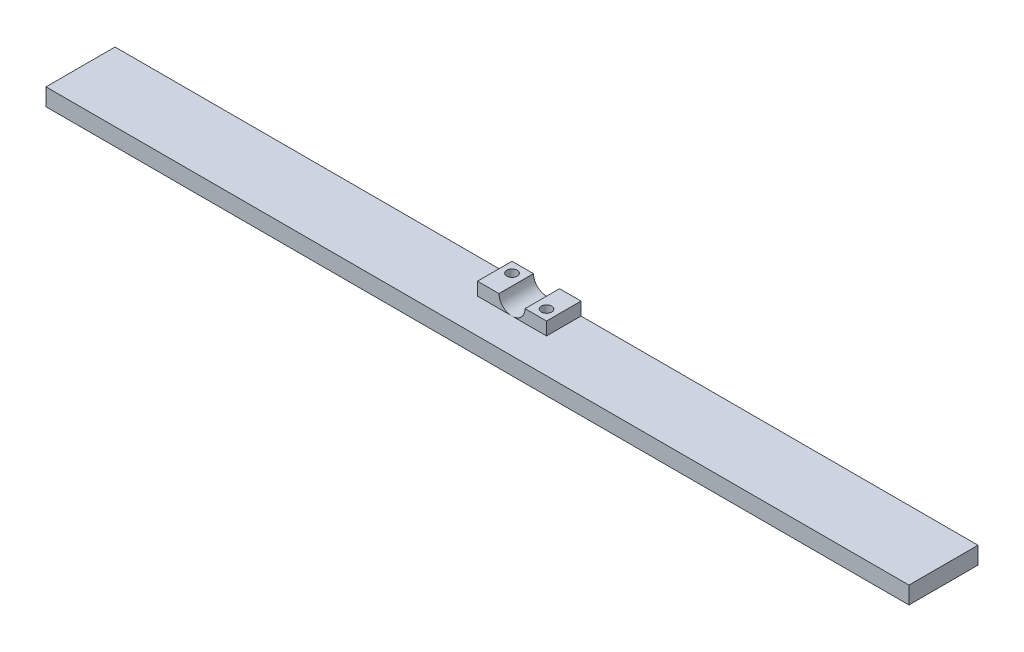
ISO-10303-21;
HEADER;
FILE_DESCRIPTION(('STEP AP214'),'2;1');
FILE_NAME('part.step','',(''),(''),'','','');
FILE_SCHEMA(('AUTOMOTIVE_DESIGN { 1 0 10303 214 1 1 1 1 }'));
ENDSEC;
DATA;
#1=APPLICATION_CONTEXT('core data for automotive mechanical design processes');
#2=APPLICATION_PROTOCOL_DEFINITION('international standard','automotive_design',2000,#1);
#3=PRODUCT_CONTEXT('',#1,'mechanical');
#4=PRODUCT('Part','Part','',(#3));
#5=PRODUCT_RELATED_PRODUCT_CATEGORY('part','',(#4));
#6=PRODUCT_DEFINITION_FORMATION('','',#4);
#7=PRODUCT_DEFINITION_CONTEXT('part definition',#1,'design');
#8=PRODUCT_DEFINITION('design','',#6,#7);
#9=PRODUCT_DEFINITION_SHAPE('','',#8);
#10=(LENGTH_UNIT() NAMED_UNIT(*) SI_UNIT(.MILLI.,.METRE.));
#11=(NAMED_UNIT(*) PLANE_ANGLE_UNIT() SI_UNIT($,.RADIAN.));
#12=(NAMED_UNIT(*) SI_UNIT($,.STERADIAN.) SOLID_ANGLE_UNIT());
#13=UNCERTAINTY_MEASURE_WITH_UNIT(LENGTH_MEASURE(1.E-05),#10,'distance_accuracy_value','');
#14=(GEOMETRIC_REPRESENTATION_CONTEXT(3) GLOBAL_UNCERTAINTY_ASSIGNED_CONTEXT((#13)) GLOBAL_UNIT_ASSIGNED_CONTEXT((#10,
#11,#12)) REPRESENTATION_CONTEXT('',''));
#15=CARTESIAN_POINT('',(0.,0.,0.));
#16=DIRECTION('',(0.,0.,1.));
#17=DIRECTION('',(1.,0.,0.));
#18=AXIS2_PLACEMENT_3D('',#15,#16,#17);
#19=CARTESIAN_POINT('',(72.0778160983004,8.75,3.27362334532328));
#20=DIRECTION('',(0.,0.,-1.));
#21=DIRECTION('',(-1.,0.,0.));
#22=AXIS2_PLACEMENT_3D('',#19,#20,#21);
#23=PLANE('',#22);
#24=DIRECTION('',(1.,0.,0.));
#25=VECTOR('',#24,1.);
#26=CARTESIAN_POINT('',(72.0778160983004,8.75,3.27362334532328));
#27=LINE('',#26,#25);
#28=CARTESIAN_POINT('',(85.8528160983005,8.75,3.27362334532328));
#29=VERTEX_POINT('',#28);
#30=CARTESIAN_POINT('',(92.0778160983004,8.75,3.27362334532328));
#31=VERTEX_POINT('',#30);
#32=EDGE_CURVE('E135',#29,#31,#27,.T.);
#33=ORIENTED_EDGE('',*,*,#32,.F.);
#34=CARTESIAN_POINT('',(82.0778160983004,8.75,3.27362334532328));
#35=DIRECTION('',(0.,0.,1.));
#36=DIRECTION('',(1.,0.,0.));
#37=AXIS2_PLACEMENT_3D('',#34,#35,#36);
#38=CIRCLE('',#37,3.775);
#39=CARTESIAN_POINT('',(82.5115498876229,5.,3.27362334532328));
#40=VERTEX_POINT('',#39);
#41=EDGE_CURVE('E48',#40,#29,#38,.T.);
#42=ORIENTED_EDGE('',*,*,#41,.F.);
#43=DIRECTION('',(1.,0.,0.));
#44=VECTOR('',#43,1.);
#45=CARTESIAN_POINT('',(72.0778160983004,5.,3.27362334532328));
#46=LINE('',#45,#44);
#47=CARTESIAN_POINT('',(92.0778160983004,5.,3.27362334532328));
#48=VERTEX_POINT('',#47);
#49=EDGE_CURVE('E148',#40,#48,#46,.T.);
#50=ORIENTED_EDGE('',*,*,#49,.T.);
#51=DIRECTION('',(0.,-1.,0.));
#52=VECTOR('',#51,1.);
#53=CARTESIAN_POINT('',(92.0778160983004,8.75,3.27362334532328));
#54=LINE('',#53,#52);
#55=EDGE_CURVE('E151',#31,#48,#54,.T.);
#56=ORIENTED_EDGE('',*,*,#55,.F.);
#57=EDGE_LOOP('',(#33,#42,#50,#56));
#58=FACE_BOUND('',#57,.T.);
#59=ADVANCED_FACE('F33',(#58),#23,.F.);
#60=CARTESIAN_POINT('',(0.,8.75,0.));
#61=DIRECTION('',(0.,1.,0.));
#62=DIRECTION('',(0.,0.,1.));
#63=AXIS2_PLACEMENT_3D('',#60,#61,#62);
#64=PLANE('',#63);
#65=CARTESIAN_POINT('',(75.0778160983004,8.75,-3.72637665467672));
#66=DIRECTION('',(0.,1.,0.));
#67=DIRECTION('',(0.,0.,1.));
#68=AXIS2_PLACEMENT_3D('',#65,#66,#67);
#69=CIRCLE('',#68,1.5);
#70=CARTESIAN_POINT('',(75.0778160983004,8.75,-2.22637665467672));
#71=VERTEX_POINT('',#70);
#72=EDGE_CURVE('E234',#71,#71,#69,.T.);
#73=ORIENTED_EDGE('',*,*,#72,.F.);
#74=EDGE_LOOP('',(#73));
#75=FACE_BOUND('',#74,.T.);
#76=DIRECTION('',(0.,0.,1.));
#77=VECTOR('',#76,1.);
#78=CARTESIAN_POINT('',(78.3028160983005,8.75,-6.72637665467672));
#79=LINE('',#78,#77);
#80=CARTESIAN_POINT('',(78.3028160983005,8.75,-6.72637665467672));
#81=VERTEX_POINT('',#80);
#82=CARTESIAN_POINT('',(78.3028160983005,8.75,3.27362334532328));
#83=VERTEX_POINT('',#82);
#84=EDGE_CURVE('E11',#81,#83,#79,.T.);
#85=ORIENTED_EDGE('',*,*,#84,.F.);
#86=DIRECTION('',(-1.,0.,0.));
#87=VECTOR('',#86,1.);
#88=CARTESIAN_POINT('',(72.0778160983004,8.75,-6.72637665467672));
#89=LINE('',#88,#87);
#90=CARTESIAN_POINT('',(72.0778160983004,8.75,-6.72637665467672));
#91=VERTEX_POINT('',#90);
#92=EDGE_CURVE('E137',#81,#91,#89,.T.);
#93=ORIENTED_EDGE('',*,*,#92,.T.);
#94=DIRECTION('',(0.,0.,1.));
#95=VECTOR('',#94,1.);
#96=CARTESIAN_POINT('',(72.0778160983004,8.75,-6.72637665467672));
#97=LINE('',#96,#95);
#98=CARTESIAN_POINT('',(72.0778160983004,8.75,3.27362334532328));
#99=VERTEX_POINT('',#98);
#100=EDGE_CURVE('E132',#91,#99,#97,.T.);
#101=ORIENTED_EDGE('',*,*,#100,.T.);
#102=EDGE_CURVE('E126',#99,#83,#27,.T.);
#103=ORIENTED_EDGE('',*,*,#102,.T.);
#104=EDGE_LOOP('',(#85,#93,#101,#103));
#105=FACE_BOUND('',#104,.T.);
#106=ADVANCED_FACE('F130',(#75,#105),#64,.T.);
#107=CARTESIAN_POINT('',(-42.9221839016996,5.,-6.72637665467672));
#108=DIRECTION('',(1.,0.,0.));
#109=DIRECTION('',(0.,0.,-1.));
#110=AXIS2_PLACEMENT_3D('',#107,#108,#109);
#111=PLANE('',#110);
#112=DIRECTION('',(0.,0.,1.));
#113=VECTOR('',#112,1.);
#114=CARTESIAN_POINT('',(-42.9221839016996,0.,-6.72637665467672));
#115=LINE('',#114,#113);
#116=CARTESIAN_POINT('',(-42.9221839016996,0.,-6.72637665467672));
#117=VERTEX_POINT('',#116);
#118=CARTESIAN_POINT('',(-42.9221839016996,0.,13.2736233453233));
#119=VERTEX_POINT('',#118);
#120=EDGE_CURVE('E186',#117,#119,#115,.T.);
#121=ORIENTED_EDGE('',*,*,#120,.T.);
#122=DIRECTION('',(0.,-1.,0.));
#123=VECTOR('',#122,1.);
#124=CARTESIAN_POINT('',(-42.9221839016996,5.,13.2736233453233));
#125=LINE('',#124,#123);
#126=CARTESIAN_POINT('',(-42.9221839016996,5.,13.2736233453233));
#127=VERTEX_POINT('',#126);
#128=EDGE_CURVE('E163',#127,#119,#125,.T.);
#129=ORIENTED_EDGE('',*,*,#128,.F.);
#130=DIRECTION('',(0.,0.,1.));
#131=VECTOR('',#130,1.);
#132=CARTESIAN_POINT('',(-42.9221839016996,5.,-6.72637665467672));
#133=LINE('',#132,#131);
#134=CARTESIAN_POINT('',(-42.9221839016996,5.,-6.72637665467672));
#135=VERTEX_POINT('',#134);
#136=EDGE_CURVE('E196',#135,#127,#133,.T.);
#137=ORIENTED_EDGE('',*,*,#136,.F.);
#138=DIRECTION('',(0.,-1.,0.));
#139=VECTOR('',#138,1.);
#140=CARTESIAN_POINT('',(-42.9221839016996,5.,-6.72637665467672));
#141=LINE('',#140,#139);
#142=EDGE_CURVE('E178',#135,#117,#141,.T.);
#143=ORIENTED_EDGE('',*,*,#142,.T.);
#144=EDGE_LOOP('',(#121,#129,#137,#143));
#145=FACE_BOUND('',#144,.T.);
#146=ADVANCED_FACE('F35',(#145),#111,.F.);
#147=CARTESIAN_POINT('',(-42.9221839016996,5.,13.2736233453233));
#148=DIRECTION('',(0.,0.,-1.));
#149=DIRECTION('',(-1.,0.,0.));
#150=AXIS2_PLACEMENT_3D('',#147,#148,#149);
#151=PLANE('',#150);
#152=DIRECTION('',(1.,0.,0.));
#153=VECTOR('',#152,1.);
#154=CARTESIAN_POINT('',(-42.9221839016996,0.,13.2736233453233));
#155=LINE('',#154,#153);
#156=CARTESIAN_POINT('',(207.0778160983,0.,13.2736233453233));
#157=VERTEX_POINT('',#156);
#158=EDGE_CURVE('E189',#119,#157,#155,.T.);
#159=ORIENTED_EDGE('',*,*,#158,.T.);
#160=DIRECTION('',(0.,-1.,0.));
#161=VECTOR('',#160,1.);
#162=CARTESIAN_POINT('',(207.0778160983,5.,13.2736233453233));
#163=LINE('',#162,#161);
#164=CARTESIAN_POINT('',(207.0778160983,5.,13.2736233453233));
#165=VERTEX_POINT('',#164);
#166=EDGE_CURVE('E165',#165,#157,#163,.T.);
#167=ORIENTED_EDGE('',*,*,#166,.F.);
#168=DIRECTION('',(1.,0.,0.));
#169=VECTOR('',#168,1.);
#170=CARTESIAN_POINT('',(-42.9221839016996,5.,13.2736233453233));
#171=LINE('',#170,#169);
#172=EDGE_CURVE('E281',#127,#165,#171,.T.);
#173=ORIENTED_EDGE('',*,*,#172,.F.);
#174=ORIENTED_EDGE('',*,*,#128,.T.);
#175=EDGE_LOOP('',(#159,#167,#173,#174));
#176=FACE_BOUND('',#175,.T.);
#177=ADVANCED_FACE('F256',(#176),#151,.F.);
#178=CARTESIAN_POINT('',(207.0778160983,5.,-6.72637665467672));
#179=DIRECTION('',(-1.,0.,0.));
#180=DIRECTION('',(0.,0.,1.));
#181=AXIS2_PLACEMENT_3D('',#178,#179,#180);
#182=PLANE('',#181);
#183=DIRECTION('',(0.,0.,-1.));
#184=VECTOR('',#183,1.);
#185=CARTESIAN_POINT('',(207.0778160983,0.,-6.72637665467672));
#186=LINE('',#185,#184);
#187=CARTESIAN_POINT('',(207.0778160983,0.,-6.72637665467672));
#188=VERTEX_POINT('',#187);
#189=EDGE_CURVE('E192',#157,#188,#186,.T.);
#190=ORIENTED_EDGE('',*,*,#189,.T.);
#191=DIRECTION('',(0.,-1.,0.));
#192=VECTOR('',#191,1.);
#193=CARTESIAN_POINT('',(207.0778160983,5.,-6.72637665467672));
#194=LINE('',#193,#192);
#195=CARTESIAN_POINT('',(207.0778160983,5.,-6.72637665467672));
#196=VERTEX_POINT('',#195);
#197=EDGE_CURVE('E171',#196,#188,#194,.T.);
#198=ORIENTED_EDGE('',*,*,#197,.F.);
#199=DIRECTION('',(0.,0.,-1.));
#200=VECTOR('',#199,1.);
#201=CARTESIAN_POINT('',(207.0778160983,5.,-6.72637665467672));
#202=LINE('',#201,#200);
#203=EDGE_CURVE('E184',#165,#196,#202,.T.);
#204=ORIENTED_EDGE('',*,*,#203,.F.);
#205=ORIENTED_EDGE('',*,*,#166,.T.);
#206=EDGE_LOOP('',(#190,#198,#204,#205));
#207=FACE_BOUND('',#206,.T.);
#208=ADVANCED_FACE('F284',(#207),#182,.F.);
#209=CARTESIAN_POINT('',(-42.9221839016996,5.,-6.72637665467672));
#210=DIRECTION('',(0.,0.,1.));
#211=DIRECTION('',(1.,0.,0.));
#212=AXIS2_PLACEMENT_3D('',#209,#210,#211);
#213=PLANE('',#212);
#214=ORIENTED_EDGE('',*,*,#92,.F.);
#215=CARTESIAN_POINT('',(82.0778160983004,8.75,-6.72637665467672));
#216=DIRECTION('',(0.,0.,1.));
#217=DIRECTION('',(1.,0.,0.));
#218=AXIS2_PLACEMENT_3D('',#215,#216,#217);
#219=CIRCLE('',#218,3.775);
#220=CARTESIAN_POINT('',(85.8528160983005,8.75,-6.72637665467672));
#221=VERTEX_POINT('',#220);
#222=EDGE_CURVE('E120',#81,#221,#219,.T.);
#223=ORIENTED_EDGE('',*,*,#222,.T.);
#224=CARTESIAN_POINT('',(92.0778160983004,8.75,-6.72637665467672));
#225=VERTEX_POINT('',#224);
#226=EDGE_CURVE('E142',#225,#221,#89,.T.);
#227=ORIENTED_EDGE('',*,*,#226,.F.);
#228=DIRECTION('',(0.,-1.,0.));
#229=VECTOR('',#228,1.);
#230=CARTESIAN_POINT('',(92.0778160983004,8.75,-6.72637665467672));
#231=LINE('',#230,#229);
#232=CARTESIAN_POINT('',(92.0778160983005,5.,-6.72637665467672));
#233=VERTEX_POINT('',#232);
#234=EDGE_CURVE('E159',#225,#233,#231,.T.);
#235=ORIENTED_EDGE('',*,*,#234,.T.);
#236=DIRECTION('',(-1.,0.,0.));
#237=VECTOR('',#236,1.);
#238=CARTESIAN_POINT('',(-42.9221839016996,5.,-6.72637665467672));
#239=LINE('',#238,#237);
#240=EDGE_CURVE('E175',#196,#233,#239,.T.);
#241=ORIENTED_EDGE('',*,*,#240,.F.);
#242=ORIENTED_EDGE('',*,*,#197,.T.);
#243=DIRECTION('',(-1.,0.,0.));
#244=VECTOR('',#243,1.);
#245=CARTESIAN_POINT('',(-42.9221839016996,0.,-6.72637665467672));
#246=LINE('',#245,#244);
#247=EDGE_CURVE('E194',#188,#117,#246,.T.);
#248=ORIENTED_EDGE('',*,*,#247,.T.);
#249=ORIENTED_EDGE('',*,*,#142,.F.);
#250=CARTESIAN_POINT('',(72.0778160983004,5.,-6.72637665467672));
#251=VERTEX_POINT('',#250);
#252=EDGE_CURVE('E179',#251,#135,#239,.T.);
#253=ORIENTED_EDGE('',*,*,#252,.F.);
#254=DIRECTION('',(0.,-1.,0.));
#255=VECTOR('',#254,1.);
#256=CARTESIAN_POINT('',(72.0778160983004,8.75,-6.72637665467672));
#257=LINE('',#256,#255);
#258=EDGE_CURVE('E145',#91,#251,#257,.T.);
#259=ORIENTED_EDGE('',*,*,#258,.F.);
#260=EDGE_LOOP('',(#214,#223,#227,#235,#241,#242,#248,#249,#253,#259));
#261=FACE_BOUND('',#260,.T.);
#262=ADVANCED_FACE('F203',(#261),#213,.F.);
#263=CARTESIAN_POINT('',(0.,5.,0.));
#264=DIRECTION('',(0.,1.,0.));
#265=DIRECTION('',(0.,0.,1.));
#266=AXIS2_PLACEMENT_3D('',#263,#264,#265);
#267=PLANE('',#266);
#268=DIRECTION('',(0.,0.,1.));
#269=VECTOR('',#268,1.);
#270=CARTESIAN_POINT('',(72.0778160983004,5.,-6.72637665467672));
#271=LINE('',#270,#269);
#272=CARTESIAN_POINT('',(72.0778160983004,5.,3.27362334532328));
#273=VERTEX_POINT('',#272);
#274=EDGE_CURVE('E220',#251,#273,#271,.T.);
#275=ORIENTED_EDGE('',*,*,#274,.F.);
#276=ORIENTED_EDGE('',*,*,#252,.T.);
#277=ORIENTED_EDGE('',*,*,#136,.T.);
#278=ORIENTED_EDGE('',*,*,#172,.T.);
#279=ORIENTED_EDGE('',*,*,#203,.T.);
#280=ORIENTED_EDGE('',*,*,#240,.T.);
#281=DIRECTION('',(0.,0.,-1.));
#282=VECTOR('',#281,1.);
#283=CARTESIAN_POINT('',(92.0778160983004,5.,-6.72637665467672));
#284=LINE('',#283,#282);
#285=EDGE_CURVE('E147',#48,#233,#284,.T.);
#286=ORIENTED_EDGE('',*,*,#285,.F.);
#287=ORIENTED_EDGE('',*,*,#49,.F.);
#288=DIRECTION('',(1.,0.,0.));
#289=VECTOR('',#288,1.);
#290=CARTESIAN_POINT('',(0.,5.,3.27362334532328));
#291=LINE('',#290,#289);
#292=CARTESIAN_POINT('',(81.644082308978,5.,3.27362334532328));
#293=VERTEX_POINT('',#292);
#294=EDGE_CURVE('E223',#293,#40,#291,.T.);
#295=ORIENTED_EDGE('',*,*,#294,.F.);
#296=EDGE_CURVE('E56',#273,#293,#46,.T.);
#297=ORIENTED_EDGE('',*,*,#296,.F.);
#298=EDGE_LOOP('',(#275,#276,#277,#278,#279,#280,#286,#287,#295,#297));
#299=FACE_BOUND('',#298,.T.);
#300=ADVANCED_FACE('F280',(#299),#267,.T.);
#301=CARTESIAN_POINT('',(0.,0.,0.));
#302=DIRECTION('',(0.,1.,0.));
#303=DIRECTION('',(0.,0.,1.));
#304=AXIS2_PLACEMENT_3D('',#301,#302,#303);
#305=PLANE('',#304);
#306=ORIENTED_EDGE('',*,*,#120,.F.);
#307=ORIENTED_EDGE('',*,*,#247,.F.);
#308=ORIENTED_EDGE('',*,*,#189,.F.);
#309=ORIENTED_EDGE('',*,*,#158,.F.);
#310=EDGE_LOOP('',(#306,#307,#308,#309));
#311=FACE_BOUND('',#310,.T.);
#312=ADVANCED_FACE('F210',(#311),#305,.F.);
#313=CARTESIAN_POINT('',(72.0778160983004,8.75,-6.72637665467672));
#314=DIRECTION('',(1.,0.,0.));
#315=DIRECTION('',(0.,0.,-1.));
#316=AXIS2_PLACEMENT_3D('',#313,#314,#315);
#317=PLANE('',#316);
#318=ORIENTED_EDGE('',*,*,#274,.T.);
#319=DIRECTION('',(0.,-1.,0.));
#320=VECTOR('',#319,1.);
#321=CARTESIAN_POINT('',(72.0778160983004,8.75,3.27362334532328));
#322=LINE('',#321,#320);
#323=EDGE_CURVE('E190',#99,#273,#322,.T.);
#324=ORIENTED_EDGE('',*,*,#323,.F.);
#325=ORIENTED_EDGE('',*,*,#100,.F.);
#326=ORIENTED_EDGE('',*,*,#258,.T.);
#327=EDGE_LOOP('',(#318,#324,#325,#326));
#328=FACE_BOUND('',#327,.T.);
#329=ADVANCED_FACE('F219',(#328),#317,.F.);
#330=ORIENTED_EDGE('',*,*,#296,.T.);
#331=EDGE_CURVE('E118',#83,#293,#38,.T.);
#332=ORIENTED_EDGE('',*,*,#331,.F.);
#333=ORIENTED_EDGE('',*,*,#102,.F.);
#334=ORIENTED_EDGE('',*,*,#323,.T.);
#335=EDGE_LOOP('',(#330,#332,#333,#334));
#336=FACE_BOUND('',#335,.T.);
#337=ADVANCED_FACE('F125',(#336),#23,.F.);
#338=CARTESIAN_POINT('',(92.0778160983004,8.75,-6.72637665467672));
#339=DIRECTION('',(-1.,0.,0.));
#340=DIRECTION('',(0.,0.,1.));
#341=AXIS2_PLACEMENT_3D('',#338,#339,#340);
#342=PLANE('',#341);
#343=ORIENTED_EDGE('',*,*,#285,.T.);
#344=ORIENTED_EDGE('',*,*,#234,.F.);
#345=DIRECTION('',(0.,0.,-1.));
#346=VECTOR('',#345,1.);
#347=CARTESIAN_POINT('',(92.0778160983004,8.75,-6.72637665467672));
#348=LINE('',#347,#346);
#349=EDGE_CURVE('E134',#31,#225,#348,.T.);
#350=ORIENTED_EDGE('',*,*,#349,.F.);
#351=ORIENTED_EDGE('',*,*,#55,.T.);
#352=EDGE_LOOP('',(#343,#344,#350,#351));
#353=FACE_BOUND('',#352,.T.);
#354=ADVANCED_FACE('F262',(#353),#342,.F.);
#355=CARTESIAN_POINT('',(89.0778160983004,8.75,0.273623345323282));
#356=DIRECTION('',(0.,1.,0.));
#357=DIRECTION('',(0.,0.,1.));
#358=AXIS2_PLACEMENT_3D('',#355,#356,#357);
#359=CIRCLE('',#358,1.5);
#360=CARTESIAN_POINT('',(89.0778160983004,8.75,1.77362334532328));
#361=VERTEX_POINT('',#360);
#362=EDGE_CURVE('E228',#361,#361,#359,.T.);
#363=ORIENTED_EDGE('',*,*,#362,.F.);
#364=EDGE_LOOP('',(#363));
#365=FACE_BOUND('',#364,.T.);
#366=DIRECTION('',(0.,0.,1.));
#367=VECTOR('',#366,1.);
#368=CARTESIAN_POINT('',(85.8528160983005,8.75,-6.72637665467672));
#369=LINE('',#368,#367);
#370=EDGE_CURVE('E41',#29,#221,#369,.F.);
#371=ORIENTED_EDGE('',*,*,#370,.F.);
#372=ORIENTED_EDGE('',*,*,#32,.T.);
#373=ORIENTED_EDGE('',*,*,#349,.T.);
#374=ORIENTED_EDGE('',*,*,#226,.T.);
#375=EDGE_LOOP('',(#371,#372,#373,#374));
#376=FACE_BOUND('',#375,.T.);
#377=ADVANCED_FACE('F251',(#365,#376),#64,.T.);
#378=CARTESIAN_POINT('',(82.0778160983004,8.75,-6.72637665467672));
#379=DIRECTION('',(0.,0.,1.));
#380=DIRECTION('',(1.,0.,0.));
#381=AXIS2_PLACEMENT_3D('',#378,#379,#380);
#382=CYLINDRICAL_SURFACE('',#381,3.775);
#383=ORIENTED_EDGE('',*,*,#84,.T.);
#384=ORIENTED_EDGE('',*,*,#331,.T.);
#385=EDGE_CURVE('E128',#293,#40,#38,.T.);
#386=ORIENTED_EDGE('',*,*,#385,.T.);
#387=ORIENTED_EDGE('',*,*,#41,.T.);
#388=ORIENTED_EDGE('',*,*,#370,.T.);
#389=ORIENTED_EDGE('',*,*,#222,.F.);
#390=EDGE_LOOP('',(#383,#384,#386,#387,#388,#389));
#391=FACE_BOUND('',#390,.T.);
#392=ADVANCED_FACE('F117',(#391),#382,.F.);
#393=CARTESIAN_POINT('',(82.0778160983004,8.75,3.27362334532328));
#394=DIRECTION('',(0.,0.,1.));
#395=DIRECTION('',(1.,0.,0.));
#396=AXIS2_PLACEMENT_3D('',#393,#394,#395);
#397=PLANE('',#396);
#398=ORIENTED_EDGE('',*,*,#294,.T.);
#399=ORIENTED_EDGE('',*,*,#385,.F.);
#400=EDGE_LOOP('',(#398,#399));
#401=FACE_BOUND('',#400,.T.);
#402=ADVANCED_FACE('F268',(#401),#397,.F.);
#403=CARTESIAN_POINT('',(89.0778160983004,4.75,0.273623345323282));
#404=DIRECTION('',(0.,1.,0.));
#405=DIRECTION('',(0.,0.,1.));
#406=AXIS2_PLACEMENT_3D('',#403,#404,#405);
#407=CYLINDRICAL_SURFACE('',#406,1.5);
#408=CARTESIAN_POINT('',(89.0778160983004,4.75,0.273623345323282));
#409=DIRECTION('',(0.,1.,0.));
#410=DIRECTION('',(0.,0.,1.));
#411=AXIS2_PLACEMENT_3D('',#408,#409,#410);
#412=CIRCLE('',#411,1.5);
#413=CARTESIAN_POINT('',(89.0778160983004,4.75,1.77362334532328));
#414=VERTEX_POINT('',#413);
#415=EDGE_CURVE('E226',#414,#414,#412,.T.);
#416=ORIENTED_EDGE('',*,*,#415,.F.);
#417=EDGE_LOOP('',(#416));
#418=FACE_BOUND('',#417,.T.);
#419=ORIENTED_EDGE('',*,*,#362,.T.);
#420=EDGE_LOOP('',(#419));
#421=FACE_BOUND('',#420,.T.);
#422=ADVANCED_FACE('F375',(#418,#421),#407,.F.);
#423=CARTESIAN_POINT('',(89.0778160983004,4.75,0.273623345323282));
#424=DIRECTION('',(0.,1.,0.));
#425=DIRECTION('',(0.,0.,1.));
#426=AXIS2_PLACEMENT_3D('',#423,#424,#425);
#427=PLANE('',#426);
#428=ORIENTED_EDGE('',*,*,#415,.T.);
#429=EDGE_LOOP('',(#428));
#430=FACE_BOUND('',#429,.T.);
#431=ADVANCED_FACE('F245',(#430),#427,.T.);
#432=CARTESIAN_POINT('',(75.0778160983004,4.75,-3.72637665467672));
#433=DIRECTION('',(0.,1.,0.));
#434=DIRECTION('',(0.,0.,1.));
#435=AXIS2_PLACEMENT_3D('',#432,#433,#434);
#436=CYLINDRICAL_SURFACE('',#435,1.5);
#437=CARTESIAN_POINT('',(75.0778160983004,4.75,-3.72637665467672));
#438=DIRECTION('',(0.,1.,0.));
#439=DIRECTION('',(0.,0.,1.));
#440=AXIS2_PLACEMENT_3D('',#437,#438,#439);
#441=CIRCLE('',#440,1.5);
#442=CARTESIAN_POINT('',(75.0778160983004,4.75,-2.22637665467672));
#443=VERTEX_POINT('',#442);
#444=EDGE_CURVE('E231',#443,#443,#441,.T.);
#445=ORIENTED_EDGE('',*,*,#444,.F.);
#446=EDGE_LOOP('',(#445));
#447=FACE_BOUND('',#446,.T.);
#448=ORIENTED_EDGE('',*,*,#72,.T.);
#449=EDGE_LOOP('',(#448));
#450=FACE_BOUND('',#449,.T.);
#451=ADVANCED_FACE('F242',(#447,#450),#436,.F.);
#452=CARTESIAN_POINT('',(75.0778160983004,4.75,-3.72637665467672));
#453=DIRECTION('',(0.,1.,0.));
#454=DIRECTION('',(0.,0.,1.));
#455=AXIS2_PLACEMENT_3D('',#452,#453,#454);
#456=PLANE('',#455);
#457=ORIENTED_EDGE('',*,*,#444,.T.);
#458=EDGE_LOOP('',(#457));
#459=FACE_BOUND('',#458,.T.);
#460=ADVANCED_FACE('F240',(#459),#456,.T.);
#461=CLOSED_SHELL('',(#59,#106,#146,#177,#208,#262,#300,#312,#329,#337,#354,#377,#392,#402,#422,
#431,#451,#460));
#462=MANIFOLD_SOLID_BREP('B2',#461);
#463=ADVANCED_BREP_SHAPE_REPRESENTATION('',(#18,#462),#14);
#464=SHAPE_DEFINITION_REPRESENTATION(#9,#463);
ENDSEC;
END-ISO-10303-21;
